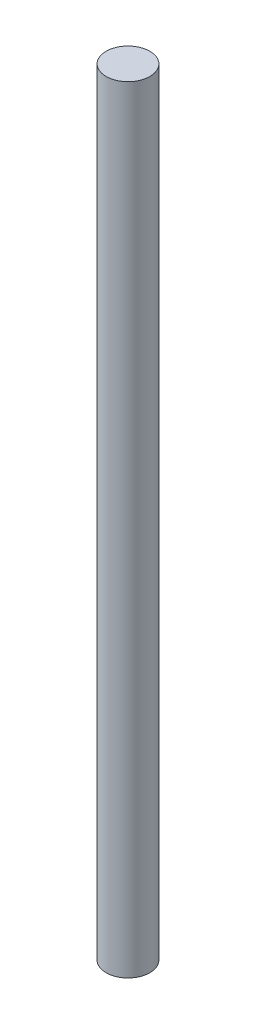
ISO-10303-21;
HEADER;
FILE_DESCRIPTION(('STEP AP214'),'2;1');
FILE_NAME('part.step','',(''),(''),'','','');
FILE_SCHEMA(('AUTOMOTIVE_DESIGN { 1 0 10303 214 1 1 1 1 }'));
ENDSEC;
DATA;
#1=APPLICATION_CONTEXT('core data for automotive mechanical design processes');
#2=APPLICATION_PROTOCOL_DEFINITION('international standard','automotive_design',2000,#1);
#3=PRODUCT_CONTEXT('',#1,'mechanical');
#4=PRODUCT('Part','Part','',(#3));
#5=PRODUCT_RELATED_PRODUCT_CATEGORY('part','',(#4));
#6=PRODUCT_DEFINITION_FORMATION('','',#4);
#7=PRODUCT_DEFINITION_CONTEXT('part definition',#1,'design');
#8=PRODUCT_DEFINITION('design','',#6,#7);
#9=PRODUCT_DEFINITION_SHAPE('','',#8);
#10=(LENGTH_UNIT() NAMED_UNIT(*) SI_UNIT(.MILLI.,.METRE.));
#11=(NAMED_UNIT(*) PLANE_ANGLE_UNIT() SI_UNIT($,.RADIAN.));
#12=(NAMED_UNIT(*) SI_UNIT($,.STERADIAN.) SOLID_ANGLE_UNIT());
#13=UNCERTAINTY_MEASURE_WITH_UNIT(LENGTH_MEASURE(1.E-05),#10,'distance_accuracy_value','');
#14=(GEOMETRIC_REPRESENTATION_CONTEXT(3) GLOBAL_UNCERTAINTY_ASSIGNED_CONTEXT((#13)) GLOBAL_UNIT_ASSIGNED_CONTEXT((#10,
#11,#12)) REPRESENTATION_CONTEXT('',''));
#15=CARTESIAN_POINT('',(0.,0.,0.));
#16=DIRECTION('',(0.,0.,1.));
#17=DIRECTION('',(1.,0.,0.));
#18=AXIS2_PLACEMENT_3D('',#15,#16,#17);
#19=CARTESIAN_POINT('',(0.,71.,0.));
#20=DIRECTION('',(0.,-1.,0.));
#21=DIRECTION('',(0.,0.,-1.));
#22=AXIS2_PLACEMENT_3D('',#19,#20,#21);
#23=CYLINDRICAL_SURFACE('',#22,2.);
#24=CARTESIAN_POINT('',(0.,71.,0.));
#25=DIRECTION('',(0.,1.,0.));
#26=DIRECTION('',(0.,0.,1.));
#27=AXIS2_PLACEMENT_3D('',#24,#25,#26);
#28=CIRCLE('',#27,2.);
#29=CARTESIAN_POINT('',(0.,71.,2.));
#30=VERTEX_POINT('',#29);
#31=EDGE_CURVE('E10',#30,#30,#28,.T.);
#32=ORIENTED_EDGE('',*,*,#31,.F.);
#33=EDGE_LOOP('',(#32));
#34=FACE_BOUND('',#33,.T.);
#35=CARTESIAN_POINT('',(0.,0.,0.));
#36=DIRECTION('',(0.,1.,0.));
#37=DIRECTION('',(0.,0.,1.));
#38=AXIS2_PLACEMENT_3D('',#35,#36,#37);
#39=CIRCLE('',#38,2.);
#40=CARTESIAN_POINT('',(0.,0.,2.));
#41=VERTEX_POINT('',#40);
#42=EDGE_CURVE('E34',#41,#41,#39,.T.);
#43=ORIENTED_EDGE('',*,*,#42,.T.);
#44=EDGE_LOOP('',(#43));
#45=FACE_BOUND('',#44,.T.);
#46=ADVANCED_FACE('F31',(#34,#45),#23,.T.);
#47=CARTESIAN_POINT('',(0.,71.,0.));
#48=DIRECTION('',(0.,1.,0.));
#49=DIRECTION('',(0.,0.,1.));
#50=AXIS2_PLACEMENT_3D('',#47,#48,#49);
#51=PLANE('',#50);
#52=ORIENTED_EDGE('',*,*,#31,.T.);
#53=EDGE_LOOP('',(#52));
#54=FACE_BOUND('',#53,.T.);
#55=ADVANCED_FACE('F46',(#54),#51,.T.);
#56=CARTESIAN_POINT('',(0.,0.,0.));
#57=DIRECTION('',(0.,1.,0.));
#58=DIRECTION('',(0.,0.,1.));
#59=AXIS2_PLACEMENT_3D('',#56,#57,#58);
#60=PLANE('',#59);
#61=ORIENTED_EDGE('',*,*,#42,.F.);
#62=EDGE_LOOP('',(#61));
#63=FACE_BOUND('',#62,.T.);
#64=ADVANCED_FACE('F44',(#63),#60,.F.);
#65=CLOSED_SHELL('',(#46,#55,#64));
#66=MANIFOLD_SOLID_BREP('B2',#65);
#67=ADVANCED_BREP_SHAPE_REPRESENTATION('',(#18,#66),#14);
#68=SHAPE_DEFINITION_REPRESENTATION(#9,#67);
ENDSEC;
END-ISO-10303-21;
